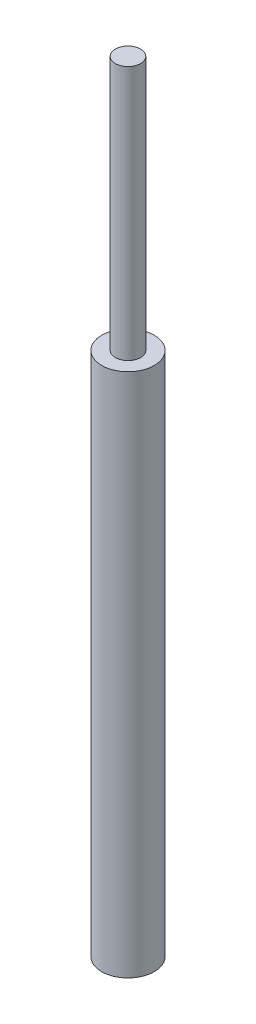
ISO-10303-21;
HEADER;
FILE_DESCRIPTION(('STEP AP214'),'2;1');
FILE_NAME('part.step','',(''),(''),'','','');
FILE_SCHEMA(('AUTOMOTIVE_DESIGN { 1 0 10303 214 1 1 1 1 }'));
ENDSEC;
DATA;
#1=APPLICATION_CONTEXT('core data for automotive mechanical design processes');
#2=APPLICATION_PROTOCOL_DEFINITION('international standard','automotive_design',2000,#1);
#3=PRODUCT_CONTEXT('',#1,'mechanical');
#4=PRODUCT('Part','Part','',(#3));
#5=PRODUCT_RELATED_PRODUCT_CATEGORY('part','',(#4));
#6=PRODUCT_DEFINITION_FORMATION('','',#4);
#7=PRODUCT_DEFINITION_CONTEXT('part definition',#1,'design');
#8=PRODUCT_DEFINITION('design','',#6,#7);
#9=PRODUCT_DEFINITION_SHAPE('','',#8);
#10=(LENGTH_UNIT() NAMED_UNIT(*) SI_UNIT(.MILLI.,.METRE.));
#11=(NAMED_UNIT(*) PLANE_ANGLE_UNIT() SI_UNIT($,.RADIAN.));
#12=(NAMED_UNIT(*) SI_UNIT($,.STERADIAN.) SOLID_ANGLE_UNIT());
#13=UNCERTAINTY_MEASURE_WITH_UNIT(LENGTH_MEASURE(1.E-05),#10,'distance_accuracy_value','');
#14=(GEOMETRIC_REPRESENTATION_CONTEXT(3) GLOBAL_UNCERTAINTY_ASSIGNED_CONTEXT((#13)) GLOBAL_UNIT_ASSIGNED_CONTEXT((#10,
#11,#12)) REPRESENTATION_CONTEXT('',''));
#15=CARTESIAN_POINT('',(0.,0.,0.));
#16=DIRECTION('',(0.,0.,1.));
#17=DIRECTION('',(1.,0.,0.));
#18=AXIS2_PLACEMENT_3D('',#15,#16,#17);
#19=CARTESIAN_POINT('',(0.,50.,0.));
#20=DIRECTION('',(0.,-1.,0.));
#21=DIRECTION('',(0.,0.,-1.));
#22=AXIS2_PLACEMENT_3D('',#19,#20,#21);
#23=CYLINDRICAL_SURFACE('',#22,5.);
#24=CARTESIAN_POINT('',(0.,50.,0.));
#25=DIRECTION('',(0.,1.,0.));
#26=DIRECTION('',(0.,0.,1.));
#27=AXIS2_PLACEMENT_3D('',#24,#25,#26);
#28=CIRCLE('',#27,5.);
#29=CARTESIAN_POINT('',(0.,50.,5.));
#30=VERTEX_POINT('',#29);
#31=EDGE_CURVE('E10',#30,#30,#28,.T.);
#32=ORIENTED_EDGE('',*,*,#31,.F.);
#33=EDGE_LOOP('',(#32));
#34=FACE_BOUND('',#33,.T.);
#35=CARTESIAN_POINT('',(0.,-50.,0.));
#36=DIRECTION('',(0.,1.,0.));
#37=DIRECTION('',(0.,0.,1.));
#38=AXIS2_PLACEMENT_3D('',#35,#36,#37);
#39=CIRCLE('',#38,5.);
#40=CARTESIAN_POINT('',(0.,-50.,5.));
#41=VERTEX_POINT('',#40);
#42=EDGE_CURVE('E51',#41,#41,#39,.T.);
#43=ORIENTED_EDGE('',*,*,#42,.T.);
#44=EDGE_LOOP('',(#43));
#45=FACE_BOUND('',#44,.T.);
#46=ADVANCED_FACE('F43',(#34,#45),#23,.T.);
#47=CARTESIAN_POINT('',(0.,50.,0.));
#48=DIRECTION('',(0.,1.,0.));
#49=DIRECTION('',(0.,0.,1.));
#50=AXIS2_PLACEMENT_3D('',#47,#48,#49);
#51=PLANE('',#50);
#52=CARTESIAN_POINT('',(0.,50.,0.));
#53=DIRECTION('',(0.,1.,0.));
#54=DIRECTION('',(0.,0.,1.));
#55=AXIS2_PLACEMENT_3D('',#52,#53,#54);
#56=CIRCLE('',#55,2.4);
#57=CARTESIAN_POINT('',(0.,50.,2.4));
#58=VERTEX_POINT('',#57);
#59=EDGE_CURVE('E57',#58,#58,#56,.F.);
#60=ORIENTED_EDGE('',*,*,#59,.T.);
#61=EDGE_LOOP('',(#60));
#62=FACE_BOUND('',#61,.T.);
#63=ORIENTED_EDGE('',*,*,#31,.T.);
#64=EDGE_LOOP('',(#63));
#65=FACE_BOUND('',#64,.T.);
#66=ADVANCED_FACE('F95',(#62,#65),#51,.T.);
#67=CARTESIAN_POINT('',(0.,-50.,0.));
#68=DIRECTION('',(0.,1.,0.));
#69=DIRECTION('',(0.,0.,1.));
#70=AXIS2_PLACEMENT_3D('',#67,#68,#69);
#71=PLANE('',#70);
#72=CARTESIAN_POINT('',(0.,-50.,0.));
#73=DIRECTION('',(0.,1.,0.));
#74=DIRECTION('',(0.,0.,1.));
#75=AXIS2_PLACEMENT_3D('',#72,#73,#74);
#76=CIRCLE('',#75,2.4);
#77=CARTESIAN_POINT('',(0.,-50.,2.4));
#78=VERTEX_POINT('',#77);
#79=EDGE_CURVE('E46',#78,#78,#76,.T.);
#80=ORIENTED_EDGE('',*,*,#79,.T.);
#81=EDGE_LOOP('',(#80));
#82=FACE_BOUND('',#81,.T.);
#83=ORIENTED_EDGE('',*,*,#42,.F.);
#84=EDGE_LOOP('',(#83));
#85=FACE_BOUND('',#84,.T.);
#86=ADVANCED_FACE('F84',(#82,#85),#71,.F.);
#87=CARTESIAN_POINT('',(0.,51.5,0.));
#88=DIRECTION('',(0.,-1.,0.));
#89=DIRECTION('',(0.,0.,-1.));
#90=AXIS2_PLACEMENT_3D('',#87,#88,#89);
#91=CYLINDRICAL_SURFACE('',#90,2.4);
#92=ORIENTED_EDGE('',*,*,#59,.F.);
#93=EDGE_LOOP('',(#92));
#94=FACE_BOUND('',#93,.T.);
#95=CARTESIAN_POINT('',(0.,98.5,0.));
#96=DIRECTION('',(0.,1.,0.));
#97=DIRECTION('',(0.,0.,1.));
#98=AXIS2_PLACEMENT_3D('',#95,#96,#97);
#99=CIRCLE('',#98,2.4);
#100=CARTESIAN_POINT('',(0.,98.5,2.4));
#101=VERTEX_POINT('',#100);
#102=EDGE_CURVE('E72',#101,#101,#99,.T.);
#103=ORIENTED_EDGE('',*,*,#102,.F.);
#104=EDGE_LOOP('',(#103));
#105=FACE_BOUND('',#104,.T.);
#106=ADVANCED_FACE('F81',(#94,#105),#91,.T.);
#107=CARTESIAN_POINT('',(0.,-51.5,0.));
#108=DIRECTION('',(0.,1.,0.));
#109=DIRECTION('',(0.,0.,1.));
#110=AXIS2_PLACEMENT_3D('',#107,#108,#109);
#111=CYLINDRICAL_SURFACE('',#110,2.4);
#112=CARTESIAN_POINT('',(0.,-51.5,0.));
#113=DIRECTION('',(0.,1.,0.));
#114=DIRECTION('',(0.,0.,1.));
#115=AXIS2_PLACEMENT_3D('',#112,#113,#114);
#116=CIRCLE('',#115,2.4);
#117=CARTESIAN_POINT('',(0.,-51.5,2.4));
#118=VERTEX_POINT('',#117);
#119=EDGE_CURVE('E60',#118,#118,#116,.T.);
#120=ORIENTED_EDGE('',*,*,#119,.T.);
#121=EDGE_LOOP('',(#120));
#122=FACE_BOUND('',#121,.T.);
#123=ORIENTED_EDGE('',*,*,#79,.F.);
#124=EDGE_LOOP('',(#123));
#125=FACE_BOUND('',#124,.T.);
#126=ADVANCED_FACE('F83',(#122,#125),#111,.T.);
#127=CARTESIAN_POINT('',(0.,-51.5,0.));
#128=DIRECTION('',(0.,-1.,0.));
#129=DIRECTION('',(0.,0.,1.));
#130=AXIS2_PLACEMENT_3D('',#127,#128,#129);
#131=PLANE('',#130);
#132=ORIENTED_EDGE('',*,*,#119,.F.);
#133=EDGE_LOOP('',(#132));
#134=FACE_BOUND('',#133,.T.);
#135=ADVANCED_FACE('F92',(#134),#131,.T.);
#136=CARTESIAN_POINT('',(0.,98.5,0.));
#137=DIRECTION('',(0.,1.,0.));
#138=DIRECTION('',(0.,0.,1.));
#139=AXIS2_PLACEMENT_3D('',#136,#137,#138);
#140=PLANE('',#139);
#141=ORIENTED_EDGE('',*,*,#102,.T.);
#142=EDGE_LOOP('',(#141));
#143=FACE_BOUND('',#142,.T.);
#144=ADVANCED_FACE('F79',(#143),#140,.T.);
#145=CLOSED_SHELL('',(#46,#66,#86,#106,#126,#135,#144));
#146=MANIFOLD_SOLID_BREP('B2',#145);
#147=ADVANCED_BREP_SHAPE_REPRESENTATION('',(#18,#146),#14);
#148=SHAPE_DEFINITION_REPRESENTATION(#9,#147);
ENDSEC;
END-ISO-10303-21;
